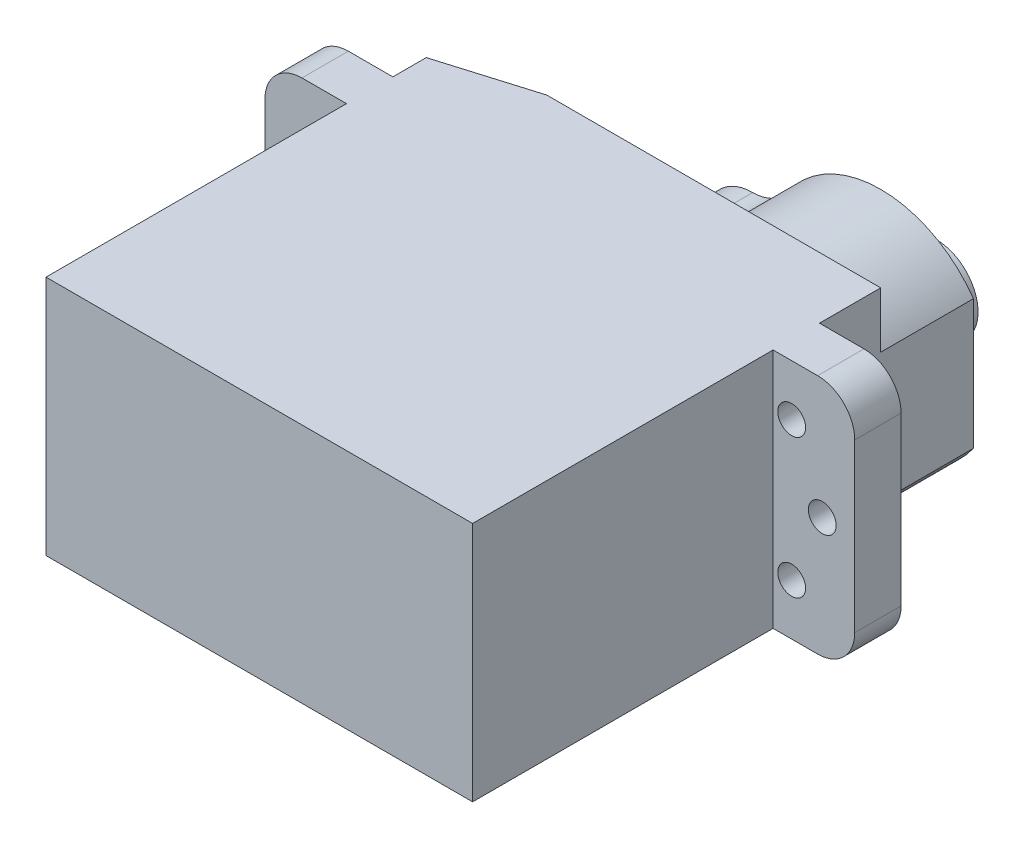
ISO-10303-21;
HEADER;
FILE_DESCRIPTION(('STEP AP214'),'2;1');
FILE_NAME('part.step','',(''),(''),'','','');
FILE_SCHEMA(('AUTOMOTIVE_DESIGN { 1 0 10303 214 1 1 1 1 }'));
ENDSEC;
DATA;
#1=APPLICATION_CONTEXT('core data for automotive mechanical design processes');
#2=APPLICATION_PROTOCOL_DEFINITION('international standard','automotive_design',2000,#1);
#3=PRODUCT_CONTEXT('',#1,'mechanical');
#4=PRODUCT('Part','Part','',(#3));
#5=PRODUCT_RELATED_PRODUCT_CATEGORY('part','',(#4));
#6=PRODUCT_DEFINITION_FORMATION('','',#4);
#7=PRODUCT_DEFINITION_CONTEXT('part definition',#1,'design');
#8=PRODUCT_DEFINITION('design','',#6,#7);
#9=PRODUCT_DEFINITION_SHAPE('','',#8);
#10=(LENGTH_UNIT() NAMED_UNIT(*) SI_UNIT(.MILLI.,.METRE.));
#11=(NAMED_UNIT(*) PLANE_ANGLE_UNIT() SI_UNIT($,.RADIAN.));
#12=(NAMED_UNIT(*) SI_UNIT($,.STERADIAN.) SOLID_ANGLE_UNIT());
#13=UNCERTAINTY_MEASURE_WITH_UNIT(LENGTH_MEASURE(1.E-05),#10,'distance_accuracy_value','');
#14=(GEOMETRIC_REPRESENTATION_CONTEXT(3) GLOBAL_UNCERTAINTY_ASSIGNED_CONTEXT((#13)) GLOBAL_UNIT_ASSIGNED_CONTEXT((#10,
#11,#12)) REPRESENTATION_CONTEXT('',''));
#15=CARTESIAN_POINT('',(0.,0.,0.));
#16=DIRECTION('',(0.,0.,1.));
#17=DIRECTION('',(1.,0.,0.));
#18=AXIS2_PLACEMENT_3D('',#15,#16,#17);
#19=CARTESIAN_POINT('',(18.,6.5,-27.));
#20=DIRECTION('',(0.,0.,-1.));
#21=DIRECTION('',(-1.,0.,0.));
#22=AXIS2_PLACEMENT_3D('',#19,#20,#21);
#23=PLANE('',#22);
#24=CARTESIAN_POINT('',(18.,6.5,-27.));
#25=DIRECTION('',(0.,0.,-1.));
#26=DIRECTION('',(-1.,0.,0.));
#27=AXIS2_PLACEMENT_3D('',#24,#25,#26);
#28=CIRCLE('',#27,6.09999999999999);
#29=CARTESIAN_POINT('',(12.9967310549777,9.98959881129271,-27.));
#30=VERTEX_POINT('',#29);
#31=CARTESIAN_POINT('',(23.,9.99428104193123,-27.));
#32=VERTEX_POINT('',#31);
#33=EDGE_CURVE('E206',#30,#32,#28,.T.);
#34=ORIENTED_EDGE('',*,*,#33,.T.);
#35=DIRECTION('',(0.,-1.,0.));
#36=VECTOR('',#35,1.);
#37=CARTESIAN_POINT('',(23.,9.99428104193123,-27.));
#38=LINE('',#37,#36);
#39=CARTESIAN_POINT('',(23.,3.00571895806877,-27.));
#40=VERTEX_POINT('',#39);
#41=EDGE_CURVE('E192',#32,#40,#38,.T.);
#42=ORIENTED_EDGE('',*,*,#41,.T.);
#43=CARTESIAN_POINT('',(18.,6.5,-27.));
#44=DIRECTION('',(0.,0.,-1.));
#45=DIRECTION('',(-1.,0.,0.));
#46=AXIS2_PLACEMENT_3D('',#43,#44,#45);
#47=CIRCLE('',#46,6.09999999999999);
#48=CARTESIAN_POINT('',(12.9967310549777,3.0104011887073,-27.));
#49=VERTEX_POINT('',#48);
#50=EDGE_CURVE('E205',#40,#49,#47,.T.);
#51=ORIENTED_EDGE('',*,*,#50,.T.);
#52=CARTESIAN_POINT('',(11.1,1.6875,-27.));
#53=DIRECTION('',(0.,0.,1.));
#54=DIRECTION('',(-1.,0.,0.));
#55=AXIS2_PLACEMENT_3D('',#52,#53,#54);
#56=CIRCLE('',#55,2.31250000000001);
#57=CARTESIAN_POINT('',(11.1,4.00000000000001,-27.));
#58=VERTEX_POINT('',#57);
#59=EDGE_CURVE('E384',#49,#58,#56,.T.);
#60=ORIENTED_EDGE('',*,*,#59,.T.);
#61=CARTESIAN_POINT('',(11.1,6.5,-27.));
#62=DIRECTION('',(0.,0.,-1.));
#63=DIRECTION('',(-1.,0.,0.));
#64=AXIS2_PLACEMENT_3D('',#61,#62,#63);
#65=CIRCLE('',#64,2.5);
#66=CARTESIAN_POINT('',(11.1,9.,-27.));
#67=VERTEX_POINT('',#66);
#68=EDGE_CURVE('E377',#58,#67,#65,.T.);
#69=ORIENTED_EDGE('',*,*,#68,.T.);
#70=CARTESIAN_POINT('',(11.1,11.3125,-27.));
#71=DIRECTION('',(0.,0.,1.));
#72=DIRECTION('',(1.,0.,0.));
#73=AXIS2_PLACEMENT_3D('',#70,#71,#72);
#74=CIRCLE('',#73,2.31250000000001);
#75=EDGE_CURVE('E211',#67,#30,#74,.T.);
#76=ORIENTED_EDGE('',*,*,#75,.T.);
#77=EDGE_LOOP('',(#34,#42,#51,#60,#69,#76));
#78=FACE_BOUND('',#77,.T.);
#79=CARTESIAN_POINT('',(18.,6.5,-27.));
#80=DIRECTION('',(0.,0.,-1.));
#81=DIRECTION('',(-1.,0.,0.));
#82=AXIS2_PLACEMENT_3D('',#79,#80,#81);
#83=CIRCLE('',#82,2.25);
#84=CARTESIAN_POINT('',(15.75,6.5,-27.));
#85=VERTEX_POINT('',#84);
#86=EDGE_CURVE('E421',#85,#85,#83,.T.);
#87=ORIENTED_EDGE('',*,*,#86,.F.);
#88=EDGE_LOOP('',(#87));
#89=FACE_BOUND('',#88,.T.);
#90=ADVANCED_FACE('F35',(#78,#89),#23,.T.);
#91=CARTESIAN_POINT('',(5.,13.,-22.));
#92=DIRECTION('',(0.,0.,1.));
#93=DIRECTION('',(1.,0.,0.));
#94=AXIS2_PLACEMENT_3D('',#91,#92,#93);
#95=PLANE('',#94);
#96=CARTESIAN_POINT('',(18.,6.5,-22.));
#97=DIRECTION('',(0.,0.,-1.));
#98=DIRECTION('',(-1.,0.,0.));
#99=AXIS2_PLACEMENT_3D('',#96,#97,#98);
#100=CIRCLE('',#99,6.09999999999999);
#101=CARTESIAN_POINT('',(12.9967310549777,9.98959881129271,-22.));
#102=VERTEX_POINT('',#101);
#103=CARTESIAN_POINT('',(23.,9.99428104193121,-22.));
#104=VERTEX_POINT('',#103);
#105=EDGE_CURVE('E218',#102,#104,#100,.T.);
#106=ORIENTED_EDGE('',*,*,#105,.F.);
#107=CARTESIAN_POINT('',(11.1,11.3125,-22.));
#108=DIRECTION('',(0.,0.,1.));
#109=DIRECTION('',(1.,0.,0.));
#110=AXIS2_PLACEMENT_3D('',#107,#108,#109);
#111=CIRCLE('',#110,2.31250000000001);
#112=CARTESIAN_POINT('',(11.1,9.,-22.));
#113=VERTEX_POINT('',#112);
#114=EDGE_CURVE('E215',#113,#102,#111,.T.);
#115=ORIENTED_EDGE('',*,*,#114,.F.);
#116=CARTESIAN_POINT('',(11.1,6.5,-22.));
#117=DIRECTION('',(0.,0.,-1.));
#118=DIRECTION('',(-1.,0.,0.));
#119=AXIS2_PLACEMENT_3D('',#116,#117,#118);
#120=CIRCLE('',#119,2.5);
#121=CARTESIAN_POINT('',(11.1,4.00000000000001,-22.));
#122=VERTEX_POINT('',#121);
#123=EDGE_CURVE('E244',#122,#113,#120,.T.);
#124=ORIENTED_EDGE('',*,*,#123,.F.);
#125=CARTESIAN_POINT('',(11.1,1.6875,-22.));
#126=DIRECTION('',(0.,0.,1.));
#127=DIRECTION('',(-1.,0.,0.));
#128=AXIS2_PLACEMENT_3D('',#125,#126,#127);
#129=CIRCLE('',#128,2.31250000000001);
#130=CARTESIAN_POINT('',(12.9967310549777,3.0104011887073,-22.));
#131=VERTEX_POINT('',#130);
#132=EDGE_CURVE('E241',#131,#122,#129,.T.);
#133=ORIENTED_EDGE('',*,*,#132,.F.);
#134=CARTESIAN_POINT('',(18.,6.5,-22.));
#135=DIRECTION('',(0.,0.,-1.));
#136=DIRECTION('',(-1.,0.,0.));
#137=AXIS2_PLACEMENT_3D('',#134,#135,#136);
#138=CIRCLE('',#137,6.09999999999999);
#139=CARTESIAN_POINT('',(23.,3.00571895806879,-22.));
#140=VERTEX_POINT('',#139);
#141=EDGE_CURVE('E233',#140,#131,#138,.T.);
#142=ORIENTED_EDGE('',*,*,#141,.F.);
#143=DIRECTION('',(0.,-1.,0.));
#144=VECTOR('',#143,1.);
#145=CARTESIAN_POINT('',(23.,13.,-22.));
#146=LINE('',#145,#144);
#147=CARTESIAN_POINT('',(23.,0.,-22.));
#148=VERTEX_POINT('',#147);
#149=EDGE_CURVE('E322',#140,#148,#146,.T.);
#150=ORIENTED_EDGE('',*,*,#149,.T.);
#151=DIRECTION('',(-1.,0.,0.));
#152=VECTOR('',#151,1.);
#153=CARTESIAN_POINT('',(5.,0.,-22.));
#154=LINE('',#153,#152);
#155=CARTESIAN_POINT('',(5.,0.,-22.));
#156=VERTEX_POINT('',#155);
#157=EDGE_CURVE('E295',#148,#156,#154,.T.);
#158=ORIENTED_EDGE('',*,*,#157,.T.);
#159=DIRECTION('',(0.,-1.,0.));
#160=VECTOR('',#159,1.);
#161=CARTESIAN_POINT('',(5.,13.,-22.));
#162=LINE('',#161,#160);
#163=CARTESIAN_POINT('',(5.,13.,-22.));
#164=VERTEX_POINT('',#163);
#165=EDGE_CURVE('E319',#164,#156,#162,.T.);
#166=ORIENTED_EDGE('',*,*,#165,.F.);
#167=DIRECTION('',(-1.,0.,0.));
#168=VECTOR('',#167,1.);
#169=CARTESIAN_POINT('',(11.5,13.,-22.));
#170=LINE('',#169,#168);
#171=CARTESIAN_POINT('',(23.,13.,-22.));
#172=VERTEX_POINT('',#171);
#173=EDGE_CURVE('E274',#172,#164,#170,.T.);
#174=ORIENTED_EDGE('',*,*,#173,.F.);
#175=EDGE_CURVE('E331',#172,#104,#146,.T.);
#176=ORIENTED_EDGE('',*,*,#175,.T.);
#177=EDGE_LOOP('',(#106,#115,#124,#133,#142,#150,#158,#166,#174,#176));
#178=FACE_BOUND('',#177,.T.);
#179=ADVANCED_FACE('F361',(#178),#95,.F.);
#180=CARTESIAN_POINT('',(0.,13.,0.));
#181=DIRECTION('',(1.,0.,0.));
#182=DIRECTION('',(0.,0.,-1.));
#183=AXIS2_PLACEMENT_3D('',#180,#181,#182);
#184=PLANE('',#183);
#185=DIRECTION('',(0.,0.,1.));
#186=VECTOR('',#185,1.);
#187=CARTESIAN_POINT('',(0.,0.,0.));
#188=LINE('',#187,#186);
#189=CARTESIAN_POINT('',(0.,0.,-16.2));
#190=VERTEX_POINT('',#189);
#191=CARTESIAN_POINT('',(0.,0.,0.));
#192=VERTEX_POINT('',#191);
#193=EDGE_CURVE('E219',#190,#192,#188,.T.);
#194=ORIENTED_EDGE('',*,*,#193,.T.);
#195=DIRECTION('',(0.,-1.,0.));
#196=VECTOR('',#195,1.);
#197=CARTESIAN_POINT('',(0.,13.,0.));
#198=LINE('',#197,#196);
#199=CARTESIAN_POINT('',(0.,13.,0.));
#200=VERTEX_POINT('',#199);
#201=EDGE_CURVE('E333',#200,#192,#198,.T.);
#202=ORIENTED_EDGE('',*,*,#201,.F.);
#203=DIRECTION('',(0.,0.,1.));
#204=VECTOR('',#203,1.);
#205=CARTESIAN_POINT('',(0.,13.,0.));
#206=LINE('',#205,#204);
#207=CARTESIAN_POINT('',(0.,13.,-16.2));
#208=VERTEX_POINT('',#207);
#209=EDGE_CURVE('E259',#208,#200,#206,.T.);
#210=ORIENTED_EDGE('',*,*,#209,.F.);
#211=DIRECTION('',(0.,-1.,0.));
#212=VECTOR('',#211,1.);
#213=CARTESIAN_POINT('',(0.,13.,-16.2));
#214=LINE('',#213,#212);
#215=EDGE_CURVE('E284',#208,#190,#214,.T.);
#216=ORIENTED_EDGE('',*,*,#215,.T.);
#217=EDGE_LOOP('',(#194,#202,#210,#216));
#218=FACE_BOUND('',#217,.T.);
#219=ADVANCED_FACE('F440',(#218),#184,.F.);
#220=CARTESIAN_POINT('',(0.,13.,0.));
#221=DIRECTION('',(0.,0.,-1.));
#222=DIRECTION('',(-1.,0.,0.));
#223=AXIS2_PLACEMENT_3D('',#220,#221,#222);
#224=PLANE('',#223);
#225=DIRECTION('',(1.,0.,0.));
#226=VECTOR('',#225,1.);
#227=CARTESIAN_POINT('',(0.,0.,0.));
#228=LINE('',#227,#226);
#229=CARTESIAN_POINT('',(23.,0.,0.));
#230=VERTEX_POINT('',#229);
#231=EDGE_CURVE('E222',#192,#230,#228,.T.);
#232=ORIENTED_EDGE('',*,*,#231,.T.);
#233=DIRECTION('',(0.,-1.,0.));
#234=VECTOR('',#233,1.);
#235=CARTESIAN_POINT('',(23.,13.,0.));
#236=LINE('',#235,#234);
#237=CARTESIAN_POINT('',(23.,13.,0.));
#238=VERTEX_POINT('',#237);
#239=EDGE_CURVE('E336',#238,#230,#236,.T.);
#240=ORIENTED_EDGE('',*,*,#239,.F.);
#241=DIRECTION('',(1.,0.,0.));
#242=VECTOR('',#241,1.);
#243=CARTESIAN_POINT('',(0.,13.,0.));
#244=LINE('',#243,#242);
#245=EDGE_CURVE('E262',#200,#238,#244,.T.);
#246=ORIENTED_EDGE('',*,*,#245,.F.);
#247=ORIENTED_EDGE('',*,*,#201,.T.);
#248=EDGE_LOOP('',(#232,#240,#246,#247));
#249=FACE_BOUND('',#248,.T.);
#250=ADVANCED_FACE('F495',(#249),#224,.F.);
#251=CARTESIAN_POINT('',(23.,13.,0.));
#252=DIRECTION('',(-1.,0.,0.));
#253=DIRECTION('',(0.,0.,1.));
#254=AXIS2_PLACEMENT_3D('',#251,#252,#253);
#255=PLANE('',#254);
#256=DIRECTION('',(0.,0.,-1.));
#257=VECTOR('',#256,1.);
#258=CARTESIAN_POINT('',(23.,0.,0.));
#259=LINE('',#258,#257);
#260=CARTESIAN_POINT('',(23.,0.,-16.2));
#261=VERTEX_POINT('',#260);
#262=EDGE_CURVE('E287',#230,#261,#259,.T.);
#263=ORIENTED_EDGE('',*,*,#262,.T.);
#264=DIRECTION('',(0.,-1.,0.));
#265=VECTOR('',#264,1.);
#266=CARTESIAN_POINT('',(23.,13.,-16.2));
#267=LINE('',#266,#265);
#268=CARTESIAN_POINT('',(23.,13.,-16.2));
#269=VERTEX_POINT('',#268);
#270=EDGE_CURVE('E339',#269,#261,#267,.T.);
#271=ORIENTED_EDGE('',*,*,#270,.F.);
#272=DIRECTION('',(0.,0.,-1.));
#273=VECTOR('',#272,1.);
#274=CARTESIAN_POINT('',(23.,13.,0.));
#275=LINE('',#274,#273);
#276=EDGE_CURVE('E265',#238,#269,#275,.T.);
#277=ORIENTED_EDGE('',*,*,#276,.F.);
#278=ORIENTED_EDGE('',*,*,#239,.T.);
#279=EDGE_LOOP('',(#263,#271,#277,#278));
#280=FACE_BOUND('',#279,.T.);
#281=ADVANCED_FACE('F491',(#280),#255,.F.);
#282=CARTESIAN_POINT('',(27.4,13.,-16.2));
#283=DIRECTION('',(0.,0.,-1.));
#284=DIRECTION('',(-1.,0.,0.));
#285=AXIS2_PLACEMENT_3D('',#282,#283,#284);
#286=PLANE('',#285);
#287=CARTESIAN_POINT('',(24.,2.75,-16.2));
#288=DIRECTION('',(0.,0.,-1.));
#289=DIRECTION('',(-1.,0.,0.));
#290=AXIS2_PLACEMENT_3D('',#287,#288,#289);
#291=CIRCLE('',#290,0.750000000000006);
#292=CARTESIAN_POINT('',(23.25,2.75,-16.2));
#293=VERTEX_POINT('',#292);
#294=EDGE_CURVE('E403',#293,#293,#291,.T.);
#295=ORIENTED_EDGE('',*,*,#294,.T.);
#296=EDGE_LOOP('',(#295));
#297=FACE_BOUND('',#296,.T.);
#298=CARTESIAN_POINT('',(24.,10.25,-16.2));
#299=DIRECTION('',(0.,0.,-1.));
#300=DIRECTION('',(-1.,0.,0.));
#301=AXIS2_PLACEMENT_3D('',#298,#299,#300);
#302=CIRCLE('',#301,0.750000000000002);
#303=CARTESIAN_POINT('',(23.25,10.25,-16.2));
#304=VERTEX_POINT('',#303);
#305=EDGE_CURVE('E397',#304,#304,#302,.T.);
#306=ORIENTED_EDGE('',*,*,#305,.T.);
#307=EDGE_LOOP('',(#306));
#308=FACE_BOUND('',#307,.T.);
#309=CARTESIAN_POINT('',(25.65,6.5,-16.2));
#310=DIRECTION('',(0.,0.,-1.));
#311=DIRECTION('',(-1.,0.,0.));
#312=AXIS2_PLACEMENT_3D('',#309,#310,#311);
#313=CIRCLE('',#312,0.750000000000002);
#314=CARTESIAN_POINT('',(24.9,6.5,-16.2));
#315=VERTEX_POINT('',#314);
#316=EDGE_CURVE('E234',#315,#315,#313,.T.);
#317=ORIENTED_EDGE('',*,*,#316,.T.);
#318=EDGE_LOOP('',(#317));
#319=FACE_BOUND('',#318,.T.);
#320=DIRECTION('',(0.,-1.,0.));
#321=VECTOR('',#320,1.);
#322=CARTESIAN_POINT('',(27.4,13.,-16.2));
#323=LINE('',#322,#321);
#324=CARTESIAN_POINT('',(27.4,11.,-16.2));
#325=VERTEX_POINT('',#324);
#326=CARTESIAN_POINT('',(27.4,2.,-16.2));
#327=VERTEX_POINT('',#326);
#328=EDGE_CURVE('E342',#325,#327,#323,.T.);
#329=ORIENTED_EDGE('',*,*,#328,.F.);
#330=CARTESIAN_POINT('',(25.4,11.,-16.2));
#331=DIRECTION('',(0.,0.,-1.));
#332=DIRECTION('',(-1.,0.,0.));
#333=AXIS2_PLACEMENT_3D('',#330,#331,#332);
#334=CIRCLE('',#333,2.);
#335=CARTESIAN_POINT('',(25.4,13.,-16.2));
#336=VERTEX_POINT('',#335);
#337=EDGE_CURVE('E11',#325,#336,#334,.F.);
#338=ORIENTED_EDGE('',*,*,#337,.T.);
#339=DIRECTION('',(1.,0.,0.));
#340=VECTOR('',#339,1.);
#341=CARTESIAN_POINT('',(27.4,13.,-16.2));
#342=LINE('',#341,#340);
#343=EDGE_CURVE('E267',#269,#336,#342,.T.);
#344=ORIENTED_EDGE('',*,*,#343,.F.);
#345=ORIENTED_EDGE('',*,*,#270,.T.);
#346=DIRECTION('',(1.,0.,0.));
#347=VECTOR('',#346,1.);
#348=CARTESIAN_POINT('',(27.4,0.,-16.2));
#349=LINE('',#348,#347);
#350=CARTESIAN_POINT('',(25.4,0.,-16.2));
#351=VERTEX_POINT('',#350);
#352=EDGE_CURVE('E289',#261,#351,#349,.T.);
#353=ORIENTED_EDGE('',*,*,#352,.T.);
#354=CARTESIAN_POINT('',(25.4,2.,-16.2));
#355=DIRECTION('',(0.,0.,-1.));
#356=DIRECTION('',(-1.,0.,0.));
#357=AXIS2_PLACEMENT_3D('',#354,#355,#356);
#358=CIRCLE('',#357,2.);
#359=EDGE_CURVE('E44',#351,#327,#358,.F.);
#360=ORIENTED_EDGE('',*,*,#359,.T.);
#361=EDGE_LOOP('',(#329,#338,#344,#345,#353,#360));
#362=FACE_BOUND('',#361,.T.);
#363=ADVANCED_FACE('F488',(#297,#308,#319,#362),#286,.F.);
#364=CARTESIAN_POINT('',(27.4,13.,-18.7));
#365=DIRECTION('',(-1.,0.,0.));
#366=DIRECTION('',(0.,0.,1.));
#367=AXIS2_PLACEMENT_3D('',#364,#365,#366);
#368=PLANE('',#367);
#369=DIRECTION('',(0.,-1.,0.));
#370=VECTOR('',#369,1.);
#371=CARTESIAN_POINT('',(27.4,13.,-18.7));
#372=LINE('',#371,#370);
#373=CARTESIAN_POINT('',(27.4,11.,-18.7));
#374=VERTEX_POINT('',#373);
#375=CARTESIAN_POINT('',(27.4,2.,-18.7));
#376=VERTEX_POINT('',#375);
#377=EDGE_CURVE('E343',#374,#376,#372,.T.);
#378=ORIENTED_EDGE('',*,*,#377,.F.);
#379=DIRECTION('',(0.,0.,-1.));
#380=VECTOR('',#379,1.);
#381=CARTESIAN_POINT('',(27.4,11.,-18.7));
#382=LINE('',#381,#380);
#383=EDGE_CURVE('E58',#374,#325,#382,.F.);
#384=ORIENTED_EDGE('',*,*,#383,.T.);
#385=ORIENTED_EDGE('',*,*,#328,.T.);
#386=DIRECTION('',(0.,0.,-1.));
#387=VECTOR('',#386,1.);
#388=CARTESIAN_POINT('',(27.4,2.,-18.7));
#389=LINE('',#388,#387);
#390=EDGE_CURVE('E538',#327,#376,#389,.T.);
#391=ORIENTED_EDGE('',*,*,#390,.T.);
#392=EDGE_LOOP('',(#378,#384,#385,#391));
#393=FACE_BOUND('',#392,.T.);
#394=ADVANCED_FACE('F484',(#393),#368,.F.);
#395=CARTESIAN_POINT('',(23.,13.,-18.7));
#396=DIRECTION('',(0.,0.,1.));
#397=DIRECTION('',(1.,0.,0.));
#398=AXIS2_PLACEMENT_3D('',#395,#396,#397);
#399=PLANE('',#398);
#400=CARTESIAN_POINT('',(24.,2.75,-18.7));
#401=DIRECTION('',(0.,0.,-1.));
#402=DIRECTION('',(1.,0.,0.));
#403=AXIS2_PLACEMENT_3D('',#400,#401,#402);
#404=CIRCLE('',#403,0.750000000000006);
#405=CARTESIAN_POINT('',(24.75,2.75,-18.7));
#406=VERTEX_POINT('',#405);
#407=EDGE_CURVE('E406',#406,#406,#404,.T.);
#408=ORIENTED_EDGE('',*,*,#407,.F.);
#409=EDGE_LOOP('',(#408));
#410=FACE_BOUND('',#409,.T.);
#411=CARTESIAN_POINT('',(24.,10.25,-18.7));
#412=DIRECTION('',(0.,0.,-1.));
#413=DIRECTION('',(-1.,0.,0.));
#414=AXIS2_PLACEMENT_3D('',#411,#412,#413);
#415=CIRCLE('',#414,0.750000000000002);
#416=CARTESIAN_POINT('',(23.25,10.25,-18.7));
#417=VERTEX_POINT('',#416);
#418=EDGE_CURVE('E400',#417,#417,#415,.T.);
#419=ORIENTED_EDGE('',*,*,#418,.F.);
#420=EDGE_LOOP('',(#419));
#421=FACE_BOUND('',#420,.T.);
#422=CARTESIAN_POINT('',(25.65,6.5,-18.7));
#423=DIRECTION('',(0.,0.,-1.));
#424=DIRECTION('',(-1.,0.,0.));
#425=AXIS2_PLACEMENT_3D('',#422,#423,#424);
#426=CIRCLE('',#425,0.750000000000002);
#427=CARTESIAN_POINT('',(24.9,6.5,-18.7));
#428=VERTEX_POINT('',#427);
#429=EDGE_CURVE('E394',#428,#428,#426,.T.);
#430=ORIENTED_EDGE('',*,*,#429,.F.);
#431=EDGE_LOOP('',(#430));
#432=FACE_BOUND('',#431,.T.);
#433=DIRECTION('',(-1.,0.,0.));
#434=VECTOR('',#433,1.);
#435=CARTESIAN_POINT('',(23.,13.,-18.7));
#436=LINE('',#435,#434);
#437=CARTESIAN_POINT('',(25.4,13.,-18.7));
#438=VERTEX_POINT('',#437);
#439=CARTESIAN_POINT('',(23.,13.,-18.7));
#440=VERTEX_POINT('',#439);
#441=EDGE_CURVE('E270',#438,#440,#436,.T.);
#442=ORIENTED_EDGE('',*,*,#441,.F.);
#443=CARTESIAN_POINT('',(25.4,11.,-18.7));
#444=DIRECTION('',(0.,0.,1.));
#445=DIRECTION('',(1.,0.,0.));
#446=AXIS2_PLACEMENT_3D('',#443,#444,#445);
#447=CIRCLE('',#446,2.);
#448=EDGE_CURVE('E536',#438,#374,#447,.F.);
#449=ORIENTED_EDGE('',*,*,#448,.T.);
#450=ORIENTED_EDGE('',*,*,#377,.T.);
#451=CARTESIAN_POINT('',(25.4,2.,-18.7));
#452=DIRECTION('',(0.,0.,1.));
#453=DIRECTION('',(1.,0.,0.));
#454=AXIS2_PLACEMENT_3D('',#451,#452,#453);
#455=CIRCLE('',#454,2.);
#456=CARTESIAN_POINT('',(25.4,0.,-18.7));
#457=VERTEX_POINT('',#456);
#458=EDGE_CURVE('E529',#376,#457,#455,.F.);
#459=ORIENTED_EDGE('',*,*,#458,.T.);
#460=DIRECTION('',(-1.,0.,0.));
#461=VECTOR('',#460,1.);
#462=CARTESIAN_POINT('',(23.,0.,-18.7));
#463=LINE('',#462,#461);
#464=CARTESIAN_POINT('',(23.,0.,-18.7));
#465=VERTEX_POINT('',#464);
#466=EDGE_CURVE('E291',#457,#465,#463,.T.);
#467=ORIENTED_EDGE('',*,*,#466,.T.);
#468=DIRECTION('',(0.,-1.,0.));
#469=VECTOR('',#468,1.);
#470=CARTESIAN_POINT('',(23.,13.,-18.7));
#471=LINE('',#470,#469);
#472=EDGE_CURVE('E325',#440,#465,#471,.T.);
#473=ORIENTED_EDGE('',*,*,#472,.F.);
#474=EDGE_LOOP('',(#442,#449,#450,#459,#467,#473));
#475=FACE_BOUND('',#474,.T.);
#476=ADVANCED_FACE('F481',(#410,#421,#432,#475),#399,.F.);
#477=CARTESIAN_POINT('',(23.,13.,-22.));
#478=DIRECTION('',(-1.,0.,0.));
#479=DIRECTION('',(0.,0.,1.));
#480=AXIS2_PLACEMENT_3D('',#477,#478,#479);
#481=PLANE('',#480);
#482=DIRECTION('',(0.,0.,-1.));
#483=VECTOR('',#482,1.);
#484=CARTESIAN_POINT('',(23.,0.,-22.));
#485=LINE('',#484,#483);
#486=EDGE_CURVE('E293',#465,#148,#485,.T.);
#487=ORIENTED_EDGE('',*,*,#486,.T.);
#488=ORIENTED_EDGE('',*,*,#149,.F.);
#489=DIRECTION('',(0.,0.,1.));
#490=VECTOR('',#489,1.);
#491=CARTESIAN_POINT('',(23.,3.00571895806877,-27.));
#492=LINE('',#491,#490);
#493=EDGE_CURVE('E202',#40,#140,#492,.T.);
#494=ORIENTED_EDGE('',*,*,#493,.F.);
#495=ORIENTED_EDGE('',*,*,#41,.F.);
#496=DIRECTION('',(0.,0.,1.));
#497=VECTOR('',#496,1.);
#498=CARTESIAN_POINT('',(23.,9.99428104193123,-27.));
#499=LINE('',#498,#497);
#500=EDGE_CURVE('E198',#32,#104,#499,.T.);
#501=ORIENTED_EDGE('',*,*,#500,.T.);
#502=ORIENTED_EDGE('',*,*,#175,.F.);
#503=DIRECTION('',(0.,0.,-1.));
#504=VECTOR('',#503,1.);
#505=CARTESIAN_POINT('',(23.,13.,-22.));
#506=LINE('',#505,#504);
#507=EDGE_CURVE('E272',#440,#172,#506,.T.);
#508=ORIENTED_EDGE('',*,*,#507,.F.);
#509=ORIENTED_EDGE('',*,*,#472,.T.);
#510=EDGE_LOOP('',(#487,#488,#494,#495,#501,#502,#508,#509));
#511=FACE_BOUND('',#510,.T.);
#512=ADVANCED_FACE('F195',(#511),#481,.F.);
#513=CARTESIAN_POINT('',(0.,13.,-20.5));
#514=DIRECTION('',(0.287347885566345,0.,0.957826285221151));
#515=DIRECTION('',(0.957826285221152,0.,-0.287347885566345));
#516=AXIS2_PLACEMENT_3D('',#513,#514,#515);
#517=PLANE('',#516);
#518=DIRECTION('',(-0.957826285221151,0.,0.287347885566345));
#519=VECTOR('',#518,1.);
#520=CARTESIAN_POINT('',(0.,0.,-20.5));
#521=LINE('',#520,#519);
#522=CARTESIAN_POINT('',(0.,0.,-20.5));
#523=VERTEX_POINT('',#522);
#524=EDGE_CURVE('E297',#156,#523,#521,.T.);
#525=ORIENTED_EDGE('',*,*,#524,.T.);
#526=DIRECTION('',(0.,-1.,0.));
#527=VECTOR('',#526,1.);
#528=CARTESIAN_POINT('',(0.,13.,-20.5));
#529=LINE('',#528,#527);
#530=CARTESIAN_POINT('',(0.,13.,-20.5));
#531=VERTEX_POINT('',#530);
#532=EDGE_CURVE('E316',#531,#523,#529,.T.);
#533=ORIENTED_EDGE('',*,*,#532,.F.);
#534=DIRECTION('',(-0.957826285221151,0.,0.287347885566345));
#535=VECTOR('',#534,1.);
#536=CARTESIAN_POINT('',(0.,13.,-20.5));
#537=LINE('',#536,#535);
#538=EDGE_CURVE('E276',#164,#531,#537,.T.);
#539=ORIENTED_EDGE('',*,*,#538,.F.);
#540=ORIENTED_EDGE('',*,*,#165,.T.);
#541=EDGE_LOOP('',(#525,#533,#539,#540));
#542=FACE_BOUND('',#541,.T.);
#543=ADVANCED_FACE('F365',(#542),#517,.F.);
#544=CARTESIAN_POINT('',(0.,13.,-18.7));
#545=DIRECTION('',(1.,0.,0.));
#546=DIRECTION('',(0.,0.,-1.));
#547=AXIS2_PLACEMENT_3D('',#544,#545,#546);
#548=PLANE('',#547);
#549=DIRECTION('',(0.,0.,1.));
#550=VECTOR('',#549,1.);
#551=CARTESIAN_POINT('',(0.,0.,-18.7));
#552=LINE('',#551,#550);
#553=CARTESIAN_POINT('',(0.,0.,-18.7));
#554=VERTEX_POINT('',#553);
#555=EDGE_CURVE('E299',#523,#554,#552,.T.);
#556=ORIENTED_EDGE('',*,*,#555,.T.);
#557=DIRECTION('',(0.,-1.,0.));
#558=VECTOR('',#557,1.);
#559=CARTESIAN_POINT('',(0.,13.,-18.7));
#560=LINE('',#559,#558);
#561=CARTESIAN_POINT('',(0.,13.,-18.7));
#562=VERTEX_POINT('',#561);
#563=EDGE_CURVE('E313',#562,#554,#560,.T.);
#564=ORIENTED_EDGE('',*,*,#563,.F.);
#565=DIRECTION('',(0.,0.,1.));
#566=VECTOR('',#565,1.);
#567=CARTESIAN_POINT('',(0.,13.,-18.7));
#568=LINE('',#567,#566);
#569=EDGE_CURVE('E278',#531,#562,#568,.T.);
#570=ORIENTED_EDGE('',*,*,#569,.F.);
#571=ORIENTED_EDGE('',*,*,#532,.T.);
#572=EDGE_LOOP('',(#556,#564,#570,#571));
#573=FACE_BOUND('',#572,.T.);
#574=ADVANCED_FACE('F472',(#573),#548,.F.);
#575=CARTESIAN_POINT('',(0.,13.,-18.7));
#576=DIRECTION('',(0.,0.,1.));
#577=DIRECTION('',(1.,0.,0.));
#578=AXIS2_PLACEMENT_3D('',#575,#576,#577);
#579=PLANE('',#578);
#580=CARTESIAN_POINT('',(-1.,10.25,-18.7));
#581=DIRECTION('',(0.,0.,-1.));
#582=DIRECTION('',(1.,0.,0.));
#583=AXIS2_PLACEMENT_3D('',#580,#581,#582);
#584=CIRCLE('',#583,0.750000000000002);
#585=CARTESIAN_POINT('',(-0.249999999999999,10.25,-18.7));
#586=VERTEX_POINT('',#585);
#587=EDGE_CURVE('E417',#586,#586,#584,.T.);
#588=ORIENTED_EDGE('',*,*,#587,.F.);
#589=EDGE_LOOP('',(#588));
#590=FACE_BOUND('',#589,.T.);
#591=CARTESIAN_POINT('',(-2.65,6.5,-18.7));
#592=DIRECTION('',(0.,0.,-1.));
#593=DIRECTION('',(1.,0.,0.));
#594=AXIS2_PLACEMENT_3D('',#591,#592,#593);
#595=CIRCLE('',#594,0.750000000000002);
#596=CARTESIAN_POINT('',(-1.9,6.5,-18.7));
#597=VERTEX_POINT('',#596);
#598=EDGE_CURVE('E414',#597,#597,#595,.T.);
#599=ORIENTED_EDGE('',*,*,#598,.F.);
#600=EDGE_LOOP('',(#599));
#601=FACE_BOUND('',#600,.T.);
#602=CARTESIAN_POINT('',(-1.,2.75,-18.7));
#603=DIRECTION('',(0.,0.,-1.));
#604=DIRECTION('',(-1.,0.,0.));
#605=AXIS2_PLACEMENT_3D('',#602,#603,#604);
#606=CIRCLE('',#605,0.750000000000003);
#607=CARTESIAN_POINT('',(-1.75,2.75,-18.7));
#608=VERTEX_POINT('',#607);
#609=EDGE_CURVE('E410',#608,#608,#606,.T.);
#610=ORIENTED_EDGE('',*,*,#609,.F.);
#611=EDGE_LOOP('',(#610));
#612=FACE_BOUND('',#611,.T.);
#613=DIRECTION('',(0.,-1.,0.));
#614=VECTOR('',#613,1.);
#615=CARTESIAN_POINT('',(-4.4,13.,-18.7));
#616=LINE('',#615,#614);
#617=CARTESIAN_POINT('',(-4.4,11.,-18.7));
#618=VERTEX_POINT('',#617);
#619=CARTESIAN_POINT('',(-4.4,2.,-18.7));
#620=VERTEX_POINT('',#619);
#621=EDGE_CURVE('E310',#618,#620,#616,.T.);
#622=ORIENTED_EDGE('',*,*,#621,.F.);
#623=CARTESIAN_POINT('',(-2.4,11.,-18.7));
#624=DIRECTION('',(0.,0.,1.));
#625=DIRECTION('',(1.,0.,0.));
#626=AXIS2_PLACEMENT_3D('',#623,#624,#625);
#627=CIRCLE('',#626,2.);
#628=CARTESIAN_POINT('',(-2.4,13.,-18.7));
#629=VERTEX_POINT('',#628);
#630=EDGE_CURVE('E527',#618,#629,#627,.F.);
#631=ORIENTED_EDGE('',*,*,#630,.T.);
#632=DIRECTION('',(-1.,0.,0.));
#633=VECTOR('',#632,1.);
#634=CARTESIAN_POINT('',(0.,13.,-18.7));
#635=LINE('',#634,#633);
#636=EDGE_CURVE('E280',#562,#629,#635,.T.);
#637=ORIENTED_EDGE('',*,*,#636,.F.);
#638=ORIENTED_EDGE('',*,*,#563,.T.);
#639=DIRECTION('',(-1.,0.,0.));
#640=VECTOR('',#639,1.);
#641=CARTESIAN_POINT('',(0.,0.,-18.7));
#642=LINE('',#641,#640);
#643=CARTESIAN_POINT('',(-2.4,0.,-18.7));
#644=VERTEX_POINT('',#643);
#645=EDGE_CURVE('E301',#554,#644,#642,.T.);
#646=ORIENTED_EDGE('',*,*,#645,.T.);
#647=CARTESIAN_POINT('',(-2.4,2.,-18.7));
#648=DIRECTION('',(0.,0.,1.));
#649=DIRECTION('',(1.,0.,0.));
#650=AXIS2_PLACEMENT_3D('',#647,#648,#649);
#651=CIRCLE('',#650,2.);
#652=EDGE_CURVE('E531',#644,#620,#651,.F.);
#653=ORIENTED_EDGE('',*,*,#652,.T.);
#654=EDGE_LOOP('',(#622,#631,#637,#638,#646,#653));
#655=FACE_BOUND('',#654,.T.);
#656=ADVANCED_FACE('F468',(#590,#601,#612,#655),#579,.F.);
#657=CARTESIAN_POINT('',(-4.4,13.,-18.7));
#658=DIRECTION('',(1.,0.,0.));
#659=DIRECTION('',(0.,0.,-1.));
#660=AXIS2_PLACEMENT_3D('',#657,#658,#659);
#661=PLANE('',#660);
#662=DIRECTION('',(0.,-1.,0.));
#663=VECTOR('',#662,1.);
#664=CARTESIAN_POINT('',(-4.4,13.,-16.2));
#665=LINE('',#664,#663);
#666=CARTESIAN_POINT('',(-4.4,11.,-16.2));
#667=VERTEX_POINT('',#666);
#668=CARTESIAN_POINT('',(-4.4,2.,-16.2));
#669=VERTEX_POINT('',#668);
#670=EDGE_CURVE('E307',#667,#669,#665,.T.);
#671=ORIENTED_EDGE('',*,*,#670,.F.);
#672=DIRECTION('',(0.,0.,1.));
#673=VECTOR('',#672,1.);
#674=CARTESIAN_POINT('',(-4.4,11.,-18.7));
#675=LINE('',#674,#673);
#676=EDGE_CURVE('E798',#667,#618,#675,.F.);
#677=ORIENTED_EDGE('',*,*,#676,.T.);
#678=ORIENTED_EDGE('',*,*,#621,.T.);
#679=DIRECTION('',(0.,0.,1.));
#680=VECTOR('',#679,1.);
#681=CARTESIAN_POINT('',(-4.4,2.,-16.2));
#682=LINE('',#681,#680);
#683=EDGE_CURVE('E807',#620,#669,#682,.T.);
#684=ORIENTED_EDGE('',*,*,#683,.T.);
#685=EDGE_LOOP('',(#671,#677,#678,#684));
#686=FACE_BOUND('',#685,.T.);
#687=ADVANCED_FACE('F464',(#686),#661,.F.);
#688=CARTESIAN_POINT('',(-4.4,13.,-16.2));
#689=DIRECTION('',(0.,0.,-1.));
#690=DIRECTION('',(-1.,0.,0.));
#691=AXIS2_PLACEMENT_3D('',#688,#689,#690);
#692=PLANE('',#691);
#693=CARTESIAN_POINT('',(-1.,10.25,-16.2));
#694=DIRECTION('',(0.,0.,-1.));
#695=DIRECTION('',(-1.,0.,0.));
#696=AXIS2_PLACEMENT_3D('',#693,#694,#695);
#697=CIRCLE('',#696,0.750000000000002);
#698=CARTESIAN_POINT('',(-1.75,10.25,-16.2));
#699=VERTEX_POINT('',#698);
#700=EDGE_CURVE('E39',#699,#699,#697,.T.);
#701=ORIENTED_EDGE('',*,*,#700,.T.);
#702=EDGE_LOOP('',(#701));
#703=FACE_BOUND('',#702,.T.);
#704=CARTESIAN_POINT('',(-2.65,6.5,-16.2));
#705=DIRECTION('',(0.,0.,-1.));
#706=DIRECTION('',(-1.,0.,0.));
#707=AXIS2_PLACEMENT_3D('',#704,#705,#706);
#708=CIRCLE('',#707,0.750000000000002);
#709=CARTESIAN_POINT('',(-3.4,6.5,-16.2));
#710=VERTEX_POINT('',#709);
#711=EDGE_CURVE('E413',#710,#710,#708,.T.);
#712=ORIENTED_EDGE('',*,*,#711,.T.);
#713=EDGE_LOOP('',(#712));
#714=FACE_BOUND('',#713,.T.);
#715=CARTESIAN_POINT('',(-1.,2.75,-16.2));
#716=DIRECTION('',(0.,0.,-1.));
#717=DIRECTION('',(-1.,0.,0.));
#718=AXIS2_PLACEMENT_3D('',#715,#716,#717);
#719=CIRCLE('',#718,0.750000000000003);
#720=CARTESIAN_POINT('',(-1.75,2.75,-16.2));
#721=VERTEX_POINT('',#720);
#722=EDGE_CURVE('E409',#721,#721,#719,.T.);
#723=ORIENTED_EDGE('',*,*,#722,.T.);
#724=EDGE_LOOP('',(#723));
#725=FACE_BOUND('',#724,.T.);
#726=DIRECTION('',(1.,0.,0.));
#727=VECTOR('',#726,1.);
#728=CARTESIAN_POINT('',(-4.4,13.,-16.2));
#729=LINE('',#728,#727);
#730=CARTESIAN_POINT('',(-2.4,13.,-16.2));
#731=VERTEX_POINT('',#730);
#732=EDGE_CURVE('E283',#731,#208,#729,.T.);
#733=ORIENTED_EDGE('',*,*,#732,.F.);
#734=CARTESIAN_POINT('',(-2.4,11.,-16.2));
#735=DIRECTION('',(0.,0.,-1.));
#736=DIRECTION('',(-1.,0.,0.));
#737=AXIS2_PLACEMENT_3D('',#734,#735,#736);
#738=CIRCLE('',#737,2.);
#739=EDGE_CURVE('E801',#731,#667,#738,.F.);
#740=ORIENTED_EDGE('',*,*,#739,.T.);
#741=ORIENTED_EDGE('',*,*,#670,.T.);
#742=CARTESIAN_POINT('',(-2.4,2.,-16.2));
#743=DIRECTION('',(0.,0.,-1.));
#744=DIRECTION('',(-1.,0.,0.));
#745=AXIS2_PLACEMENT_3D('',#742,#743,#744);
#746=CIRCLE('',#745,2.);
#747=CARTESIAN_POINT('',(-2.4,0.,-16.2));
#748=VERTEX_POINT('',#747);
#749=EDGE_CURVE('E803',#669,#748,#746,.F.);
#750=ORIENTED_EDGE('',*,*,#749,.T.);
#751=DIRECTION('',(1.,0.,0.));
#752=VECTOR('',#751,1.);
#753=CARTESIAN_POINT('',(-4.4,0.,-16.2));
#754=LINE('',#753,#752);
#755=EDGE_CURVE('E263',#748,#190,#754,.T.);
#756=ORIENTED_EDGE('',*,*,#755,.T.);
#757=ORIENTED_EDGE('',*,*,#215,.F.);
#758=EDGE_LOOP('',(#733,#740,#741,#750,#756,#757));
#759=FACE_BOUND('',#758,.T.);
#760=ADVANCED_FACE('F459',(#703,#714,#725,#759),#692,.F.);
#761=CARTESIAN_POINT('',(0.,13.,0.));
#762=DIRECTION('',(0.,-1.,0.));
#763=DIRECTION('',(0.,0.,-1.));
#764=AXIS2_PLACEMENT_3D('',#761,#762,#763);
#765=PLANE('',#764);
#766=ORIENTED_EDGE('',*,*,#636,.T.);
#767=DIRECTION('',(0.,0.,1.));
#768=VECTOR('',#767,1.);
#769=CARTESIAN_POINT('',(-2.40000000000001,13.,0.));
#770=LINE('',#769,#768);
#771=EDGE_CURVE('E800',#629,#731,#770,.T.);
#772=ORIENTED_EDGE('',*,*,#771,.T.);
#773=ORIENTED_EDGE('',*,*,#732,.T.);
#774=ORIENTED_EDGE('',*,*,#209,.T.);
#775=ORIENTED_EDGE('',*,*,#245,.T.);
#776=ORIENTED_EDGE('',*,*,#276,.T.);
#777=ORIENTED_EDGE('',*,*,#343,.T.);
#778=DIRECTION('',(0.,0.,-1.));
#779=VECTOR('',#778,1.);
#780=CARTESIAN_POINT('',(25.4,13.,0.));
#781=LINE('',#780,#779);
#782=EDGE_CURVE('E235',#336,#438,#781,.T.);
#783=ORIENTED_EDGE('',*,*,#782,.T.);
#784=ORIENTED_EDGE('',*,*,#441,.T.);
#785=ORIENTED_EDGE('',*,*,#507,.T.);
#786=ORIENTED_EDGE('',*,*,#173,.T.);
#787=ORIENTED_EDGE('',*,*,#538,.T.);
#788=ORIENTED_EDGE('',*,*,#569,.T.);
#789=EDGE_LOOP('',(#766,#772,#773,#774,#775,#776,#777,#783,#784,#785,#786,#787,#788));
#790=FACE_BOUND('',#789,.T.);
#791=ADVANCED_FACE('F369',(#790),#765,.F.);
#792=CARTESIAN_POINT('',(0.,0.,0.));
#793=DIRECTION('',(0.,-1.,0.));
#794=DIRECTION('',(0.,0.,-1.));
#795=AXIS2_PLACEMENT_3D('',#792,#793,#794);
#796=PLANE('',#795);
#797=ORIENTED_EDGE('',*,*,#755,.F.);
#798=DIRECTION('',(0.,0.,1.));
#799=VECTOR('',#798,1.);
#800=CARTESIAN_POINT('',(-2.4,0.,-18.7));
#801=LINE('',#800,#799);
#802=EDGE_CURVE('E526',#748,#644,#801,.F.);
#803=ORIENTED_EDGE('',*,*,#802,.T.);
#804=ORIENTED_EDGE('',*,*,#645,.F.);
#805=ORIENTED_EDGE('',*,*,#555,.F.);
#806=ORIENTED_EDGE('',*,*,#524,.F.);
#807=ORIENTED_EDGE('',*,*,#157,.F.);
#808=ORIENTED_EDGE('',*,*,#486,.F.);
#809=ORIENTED_EDGE('',*,*,#466,.F.);
#810=DIRECTION('',(0.,0.,-1.));
#811=VECTOR('',#810,1.);
#812=CARTESIAN_POINT('',(25.4,0.,-16.2));
#813=LINE('',#812,#811);
#814=EDGE_CURVE('E525',#457,#351,#813,.F.);
#815=ORIENTED_EDGE('',*,*,#814,.T.);
#816=ORIENTED_EDGE('',*,*,#352,.F.);
#817=ORIENTED_EDGE('',*,*,#262,.F.);
#818=ORIENTED_EDGE('',*,*,#231,.F.);
#819=ORIENTED_EDGE('',*,*,#193,.F.);
#820=EDGE_LOOP('',(#797,#803,#804,#805,#806,#807,#808,#809,#815,#816,#817,#818,#819));
#821=FACE_BOUND('',#820,.T.);
#822=ADVANCED_FACE('F355',(#821),#796,.T.);
#823=CARTESIAN_POINT('',(18.,6.5,-27.));
#824=DIRECTION('',(0.,0.,1.));
#825=DIRECTION('',(1.,0.,0.));
#826=AXIS2_PLACEMENT_3D('',#823,#824,#825);
#827=CYLINDRICAL_SURFACE('',#826,6.09999999999999);
#828=ORIENTED_EDGE('',*,*,#105,.T.);
#829=ORIENTED_EDGE('',*,*,#500,.F.);
#830=ORIENTED_EDGE('',*,*,#33,.F.);
#831=DIRECTION('',(0.,0.,1.));
#832=VECTOR('',#831,1.);
#833=CARTESIAN_POINT('',(12.9967310549777,9.98959881129271,-27.));
#834=LINE('',#833,#832);
#835=EDGE_CURVE('E249',#30,#102,#834,.T.);
#836=ORIENTED_EDGE('',*,*,#835,.T.);
#837=EDGE_LOOP('',(#828,#829,#830,#836));
#838=FACE_BOUND('',#837,.T.);
#839=ADVANCED_FACE('F217',(#838),#827,.T.);
#840=CARTESIAN_POINT('',(18.,6.5,-27.));
#841=DIRECTION('',(0.,0.,1.));
#842=DIRECTION('',(1.,0.,0.));
#843=AXIS2_PLACEMENT_3D('',#840,#841,#842);
#844=CYLINDRICAL_SURFACE('',#843,6.09999999999999);
#845=ORIENTED_EDGE('',*,*,#141,.T.);
#846=DIRECTION('',(0.,0.,1.));
#847=VECTOR('',#846,1.);
#848=CARTESIAN_POINT('',(12.9967310549777,3.0104011887073,-27.));
#849=LINE('',#848,#847);
#850=EDGE_CURVE('E224',#49,#131,#849,.T.);
#851=ORIENTED_EDGE('',*,*,#850,.F.);
#852=ORIENTED_EDGE('',*,*,#50,.F.);
#853=ORIENTED_EDGE('',*,*,#493,.T.);
#854=EDGE_LOOP('',(#845,#851,#852,#853));
#855=FACE_BOUND('',#854,.T.);
#856=ADVANCED_FACE('F386',(#855),#844,.T.);
#857=CARTESIAN_POINT('',(11.1,1.6875,-27.));
#858=DIRECTION('',(0.,0.,1.));
#859=DIRECTION('',(1.,0.,0.));
#860=AXIS2_PLACEMENT_3D('',#857,#858,#859);
#861=CYLINDRICAL_SURFACE('',#860,2.31250000000001);
#862=ORIENTED_EDGE('',*,*,#132,.T.);
#863=DIRECTION('',(0.,0.,1.));
#864=VECTOR('',#863,1.);
#865=CARTESIAN_POINT('',(11.1,4.00000000000001,-27.));
#866=LINE('',#865,#864);
#867=EDGE_CURVE('E254',#58,#122,#866,.T.);
#868=ORIENTED_EDGE('',*,*,#867,.F.);
#869=ORIENTED_EDGE('',*,*,#59,.F.);
#870=ORIENTED_EDGE('',*,*,#850,.T.);
#871=EDGE_LOOP('',(#862,#868,#869,#870));
#872=FACE_BOUND('',#871,.T.);
#873=ADVANCED_FACE('F381',(#872),#861,.F.);
#874=CARTESIAN_POINT('',(11.1,6.5,-27.));
#875=DIRECTION('',(0.,0.,1.));
#876=DIRECTION('',(1.,0.,0.));
#877=AXIS2_PLACEMENT_3D('',#874,#875,#876);
#878=CYLINDRICAL_SURFACE('',#877,2.5);
#879=ORIENTED_EDGE('',*,*,#123,.T.);
#880=DIRECTION('',(0.,0.,1.));
#881=VECTOR('',#880,1.);
#882=CARTESIAN_POINT('',(11.1,9.,-27.));
#883=LINE('',#882,#881);
#884=EDGE_CURVE('E251',#67,#113,#883,.T.);
#885=ORIENTED_EDGE('',*,*,#884,.F.);
#886=ORIENTED_EDGE('',*,*,#68,.F.);
#887=ORIENTED_EDGE('',*,*,#867,.T.);
#888=EDGE_LOOP('',(#879,#885,#886,#887));
#889=FACE_BOUND('',#888,.T.);
#890=ADVANCED_FACE('F376',(#889),#878,.T.);
#891=CARTESIAN_POINT('',(11.1,11.3125,-27.));
#892=DIRECTION('',(0.,0.,1.));
#893=DIRECTION('',(1.,0.,0.));
#894=AXIS2_PLACEMENT_3D('',#891,#892,#893);
#895=CYLINDRICAL_SURFACE('',#894,2.31250000000001);
#896=ORIENTED_EDGE('',*,*,#114,.T.);
#897=ORIENTED_EDGE('',*,*,#835,.F.);
#898=ORIENTED_EDGE('',*,*,#75,.F.);
#899=ORIENTED_EDGE('',*,*,#884,.T.);
#900=EDGE_LOOP('',(#896,#897,#898,#899));
#901=FACE_BOUND('',#900,.T.);
#902=ADVANCED_FACE('F372',(#901),#895,.F.);
#903=CARTESIAN_POINT('',(-2.40000000000001,11.,0.));
#904=DIRECTION('',(0.,0.,1.));
#905=DIRECTION('',(1.,0.,0.));
#906=AXIS2_PLACEMENT_3D('',#903,#904,#905);
#907=CYLINDRICAL_SURFACE('',#906,2.);
#908=ORIENTED_EDGE('',*,*,#630,.F.);
#909=ORIENTED_EDGE('',*,*,#676,.F.);
#910=ORIENTED_EDGE('',*,*,#739,.F.);
#911=ORIENTED_EDGE('',*,*,#771,.F.);
#912=EDGE_LOOP('',(#908,#909,#910,#911));
#913=FACE_BOUND('',#912,.T.);
#914=ADVANCED_FACE('F448',(#913),#907,.T.);
#915=CARTESIAN_POINT('',(-2.4,2.,-18.7));
#916=DIRECTION('',(0.,0.,-1.));
#917=DIRECTION('',(-1.,0.,0.));
#918=AXIS2_PLACEMENT_3D('',#915,#916,#917);
#919=CYLINDRICAL_SURFACE('',#918,2.);
#920=ORIENTED_EDGE('',*,*,#652,.F.);
#921=ORIENTED_EDGE('',*,*,#802,.F.);
#922=ORIENTED_EDGE('',*,*,#749,.F.);
#923=ORIENTED_EDGE('',*,*,#683,.F.);
#924=EDGE_LOOP('',(#920,#921,#922,#923));
#925=FACE_BOUND('',#924,.T.);
#926=ADVANCED_FACE('F505',(#925),#919,.T.);
#927=CARTESIAN_POINT('',(25.4,11.,0.));
#928=DIRECTION('',(0.,0.,-1.));
#929=DIRECTION('',(-1.,0.,0.));
#930=AXIS2_PLACEMENT_3D('',#927,#928,#929);
#931=CYLINDRICAL_SURFACE('',#930,2.);
#932=ORIENTED_EDGE('',*,*,#337,.F.);
#933=ORIENTED_EDGE('',*,*,#383,.F.);
#934=ORIENTED_EDGE('',*,*,#448,.F.);
#935=ORIENTED_EDGE('',*,*,#782,.F.);
#936=EDGE_LOOP('',(#932,#933,#934,#935));
#937=FACE_BOUND('',#936,.T.);
#938=ADVANCED_FACE('F508',(#937),#931,.T.);
#939=CARTESIAN_POINT('',(25.4,2.,-18.7));
#940=DIRECTION('',(0.,0.,1.));
#941=DIRECTION('',(1.,0.,0.));
#942=AXIS2_PLACEMENT_3D('',#939,#940,#941);
#943=CYLINDRICAL_SURFACE('',#942,2.);
#944=ORIENTED_EDGE('',*,*,#359,.F.);
#945=ORIENTED_EDGE('',*,*,#814,.F.);
#946=ORIENTED_EDGE('',*,*,#458,.F.);
#947=ORIENTED_EDGE('',*,*,#390,.F.);
#948=EDGE_LOOP('',(#944,#945,#946,#947));
#949=FACE_BOUND('',#948,.T.);
#950=ADVANCED_FACE('F37',(#949),#943,.T.);
#951=CARTESIAN_POINT('',(25.65,6.5,-13.8));
#952=DIRECTION('',(0.,0.,-1.));
#953=DIRECTION('',(-1.,0.,0.));
#954=AXIS2_PLACEMENT_3D('',#951,#952,#953);
#955=CYLINDRICAL_SURFACE('',#954,0.750000000000002);
#956=ORIENTED_EDGE('',*,*,#429,.T.);
#957=EDGE_LOOP('',(#956));
#958=FACE_BOUND('',#957,.T.);
#959=ORIENTED_EDGE('',*,*,#316,.F.);
#960=EDGE_LOOP('',(#959));
#961=FACE_BOUND('',#960,.T.);
#962=ADVANCED_FACE('F444',(#958,#961),#955,.F.);
#963=CARTESIAN_POINT('',(24.,10.25,-13.8));
#964=DIRECTION('',(0.,0.,-1.));
#965=DIRECTION('',(-1.,0.,0.));
#966=AXIS2_PLACEMENT_3D('',#963,#964,#965);
#967=CYLINDRICAL_SURFACE('',#966,0.750000000000002);
#968=ORIENTED_EDGE('',*,*,#418,.T.);
#969=EDGE_LOOP('',(#968));
#970=FACE_BOUND('',#969,.T.);
#971=ORIENTED_EDGE('',*,*,#305,.F.);
#972=EDGE_LOOP('',(#971));
#973=FACE_BOUND('',#972,.T.);
#974=ADVANCED_FACE('F565',(#970,#973),#967,.F.);
#975=CARTESIAN_POINT('',(24.,2.75,-13.8));
#976=DIRECTION('',(0.,0.,-1.));
#977=DIRECTION('',(-1.,0.,0.));
#978=AXIS2_PLACEMENT_3D('',#975,#976,#977);
#979=CYLINDRICAL_SURFACE('',#978,0.750000000000006);
#980=ORIENTED_EDGE('',*,*,#407,.T.);
#981=EDGE_LOOP('',(#980));
#982=FACE_BOUND('',#981,.T.);
#983=ORIENTED_EDGE('',*,*,#294,.F.);
#984=EDGE_LOOP('',(#983));
#985=FACE_BOUND('',#984,.T.);
#986=ADVANCED_FACE('F560',(#982,#985),#979,.F.);
#987=CARTESIAN_POINT('',(-1.,2.75,-13.8));
#988=DIRECTION('',(0.,0.,-1.));
#989=DIRECTION('',(-1.,0.,0.));
#990=AXIS2_PLACEMENT_3D('',#987,#988,#989);
#991=CYLINDRICAL_SURFACE('',#990,0.750000000000003);
#992=ORIENTED_EDGE('',*,*,#609,.T.);
#993=EDGE_LOOP('',(#992));
#994=FACE_BOUND('',#993,.T.);
#995=ORIENTED_EDGE('',*,*,#722,.F.);
#996=EDGE_LOOP('',(#995));
#997=FACE_BOUND('',#996,.T.);
#998=ADVANCED_FACE('F551',(#994,#997),#991,.F.);
#999=CARTESIAN_POINT('',(-2.65,6.5,-13.8));
#1000=DIRECTION('',(0.,0.,-1.));
#1001=DIRECTION('',(-1.,0.,0.));
#1002=AXIS2_PLACEMENT_3D('',#999,#1000,#1001);
#1003=CYLINDRICAL_SURFACE('',#1002,0.750000000000002);
#1004=ORIENTED_EDGE('',*,*,#598,.T.);
#1005=EDGE_LOOP('',(#1004));
#1006=FACE_BOUND('',#1005,.T.);
#1007=ORIENTED_EDGE('',*,*,#711,.F.);
#1008=EDGE_LOOP('',(#1007));
#1009=FACE_BOUND('',#1008,.T.);
#1010=ADVANCED_FACE('F549',(#1006,#1009),#1003,.F.);
#1011=CARTESIAN_POINT('',(-1.,10.25,-13.8));
#1012=DIRECTION('',(0.,0.,-1.));
#1013=DIRECTION('',(-1.,0.,0.));
#1014=AXIS2_PLACEMENT_3D('',#1011,#1012,#1013);
#1015=CYLINDRICAL_SURFACE('',#1014,0.750000000000002);
#1016=ORIENTED_EDGE('',*,*,#587,.T.);
#1017=EDGE_LOOP('',(#1016));
#1018=FACE_BOUND('',#1017,.T.);
#1019=ORIENTED_EDGE('',*,*,#700,.F.);
#1020=EDGE_LOOP('',(#1019));
#1021=FACE_BOUND('',#1020,.T.);
#1022=ADVANCED_FACE('F432',(#1018,#1021),#1015,.F.);
#1023=CARTESIAN_POINT('',(18.,6.5,-30.));
#1024=DIRECTION('',(0.,0.,1.));
#1025=DIRECTION('',(1.,0.,0.));
#1026=AXIS2_PLACEMENT_3D('',#1023,#1024,#1025);
#1027=CYLINDRICAL_SURFACE('',#1026,2.25);
#1028=CARTESIAN_POINT('',(18.,6.5,-30.));
#1029=DIRECTION('',(0.,0.,-1.));
#1030=DIRECTION('',(-1.,0.,0.));
#1031=AXIS2_PLACEMENT_3D('',#1028,#1029,#1030);
#1032=CIRCLE('',#1031,2.25);
#1033=CARTESIAN_POINT('',(15.75,6.5,-30.));
#1034=VERTEX_POINT('',#1033);
#1035=EDGE_CURVE('E420',#1034,#1034,#1032,.T.);
#1036=ORIENTED_EDGE('',*,*,#1035,.F.);
#1037=EDGE_LOOP('',(#1036));
#1038=FACE_BOUND('',#1037,.T.);
#1039=ORIENTED_EDGE('',*,*,#86,.T.);
#1040=EDGE_LOOP('',(#1039));
#1041=FACE_BOUND('',#1040,.T.);
#1042=ADVANCED_FACE('F429',(#1038,#1041),#1027,.T.);
#1043=CARTESIAN_POINT('',(18.,6.5,-30.));
#1044=DIRECTION('',(0.,0.,-1.));
#1045=DIRECTION('',(-1.,0.,0.));
#1046=AXIS2_PLACEMENT_3D('',#1043,#1044,#1045);
#1047=PLANE('',#1046);
#1048=ORIENTED_EDGE('',*,*,#1035,.T.);
#1049=EDGE_LOOP('',(#1048));
#1050=FACE_BOUND('',#1049,.T.);
#1051=ADVANCED_FACE('F427',(#1050),#1047,.T.);
#1052=CLOSED_SHELL('',(#90,#179,#219,#250,#281,#363,#394,#476,#512,#543,#574,#656,#687,#760,
#791,#822,#839,#856,#873,#890,#902,#914,#926,#938,#950,#962,#974,#986,#998,#1010,#1022,#1042,#1051));
#1053=MANIFOLD_SOLID_BREP('B2',#1052);
#1054=ADVANCED_BREP_SHAPE_REPRESENTATION('',(#18,#1053),#14);
#1055=SHAPE_DEFINITION_REPRESENTATION(#9,#1054);
ENDSEC;
END-ISO-10303-21;
